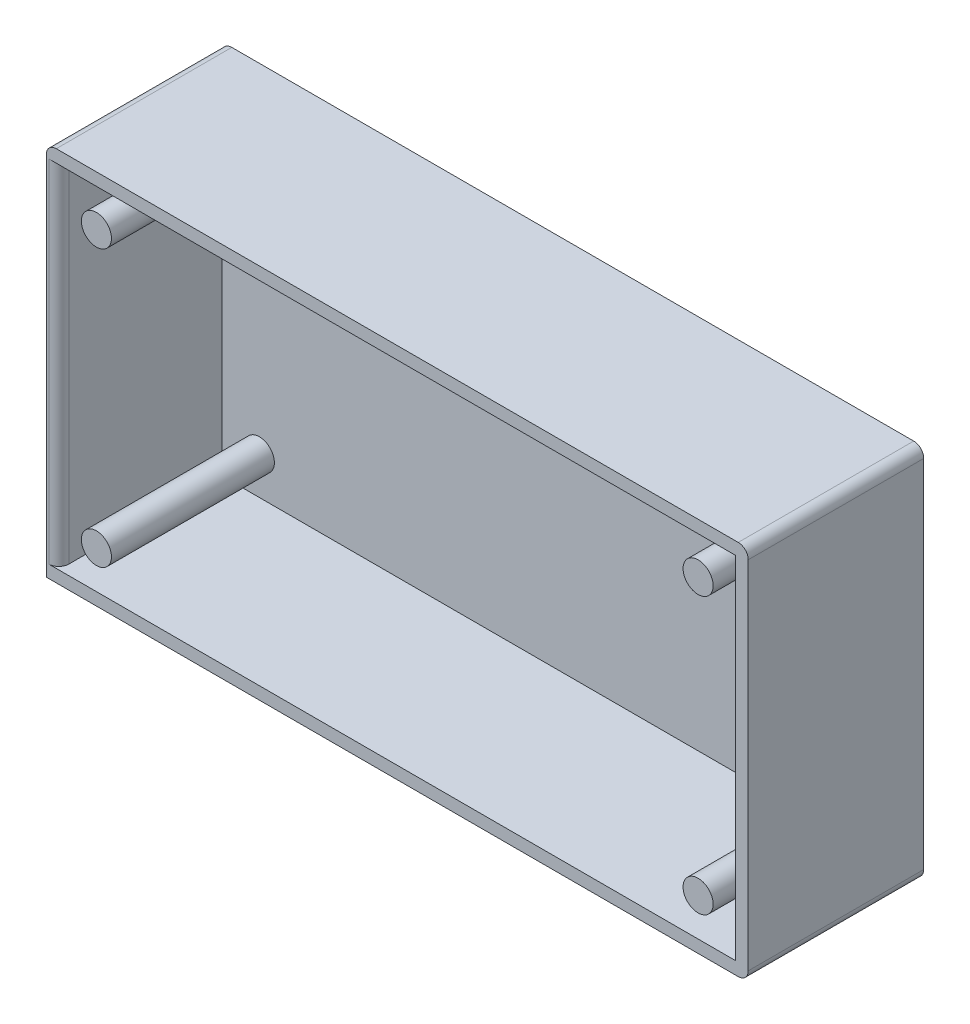
ISO-10303-21;
HEADER;
FILE_DESCRIPTION(('STEP AP214'),'2;1');
FILE_NAME('part.step','',(''),(''),'','','');
FILE_SCHEMA(('AUTOMOTIVE_DESIGN { 1 0 10303 214 1 1 1 1 }'));
ENDSEC;
DATA;
#1=APPLICATION_CONTEXT('core data for automotive mechanical design processes');
#2=APPLICATION_PROTOCOL_DEFINITION('international standard','automotive_design',2000,#1);
#3=PRODUCT_CONTEXT('',#1,'mechanical');
#4=PRODUCT('Part','Part','',(#3));
#5=PRODUCT_RELATED_PRODUCT_CATEGORY('part','',(#4));
#6=PRODUCT_DEFINITION_FORMATION('','',#4);
#7=PRODUCT_DEFINITION_CONTEXT('part definition',#1,'design');
#8=PRODUCT_DEFINITION('design','',#6,#7);
#9=PRODUCT_DEFINITION_SHAPE('','',#8);
#10=(LENGTH_UNIT() NAMED_UNIT(*) SI_UNIT(.MILLI.,.METRE.));
#11=(NAMED_UNIT(*) PLANE_ANGLE_UNIT() SI_UNIT($,.RADIAN.));
#12=(NAMED_UNIT(*) SI_UNIT($,.STERADIAN.) SOLID_ANGLE_UNIT());
#13=UNCERTAINTY_MEASURE_WITH_UNIT(LENGTH_MEASURE(1.E-05),#10,'distance_accuracy_value','');
#14=(GEOMETRIC_REPRESENTATION_CONTEXT(3) GLOBAL_UNCERTAINTY_ASSIGNED_CONTEXT((#13)) GLOBAL_UNIT_ASSIGNED_CONTEXT((#10,
#11,#12)) REPRESENTATION_CONTEXT('',''));
#15=CARTESIAN_POINT('',(0.,0.,0.));
#16=DIRECTION('',(0.,0.,1.));
#17=DIRECTION('',(1.,0.,0.));
#18=AXIS2_PLACEMENT_3D('',#15,#16,#17);
#19=CARTESIAN_POINT('',(0.,0.,2.5));
#20=DIRECTION('',(0.,0.,-1.));
#21=DIRECTION('',(-1.,0.,0.));
#22=AXIS2_PLACEMENT_3D('',#19,#20,#21);
#23=PLANE('',#22);
#24=CARTESIAN_POINT('',(65.,-32.5,2.5));
#25=DIRECTION('',(0.,0.,-1.));
#26=DIRECTION('',(-1.,0.,0.));
#27=AXIS2_PLACEMENT_3D('',#24,#25,#26);
#28=CIRCLE('',#27,2.5);
#29=CARTESIAN_POINT('',(65.,-35.,2.5));
#30=VERTEX_POINT('',#29);
#31=CARTESIAN_POINT('',(67.5,-32.5,2.5));
#32=VERTEX_POINT('',#31);
#33=EDGE_CURVE('E242',#30,#32,#28,.F.);
#34=ORIENTED_EDGE('',*,*,#33,.F.);
#35=DIRECTION('',(1.,0.,0.));
#36=VECTOR('',#35,1.);
#37=CARTESIAN_POINT('',(0.,-35.,2.5));
#38=LINE('',#37,#36);
#39=CARTESIAN_POINT('',(67.5,-35.,2.5));
#40=VERTEX_POINT('',#39);
#41=EDGE_CURVE('E188',#30,#40,#38,.T.);
#42=ORIENTED_EDGE('',*,*,#41,.T.);
#43=DIRECTION('',(0.,1.,0.));
#44=VECTOR('',#43,1.);
#45=CARTESIAN_POINT('',(67.5,0.,2.5));
#46=LINE('',#45,#44);
#47=EDGE_CURVE('E170',#40,#32,#46,.T.);
#48=ORIENTED_EDGE('',*,*,#47,.T.);
#49=EDGE_LOOP('',(#34,#42,#48));
#50=FACE_BOUND('',#49,.T.);
#51=ADVANCED_FACE('F39',(#50),#23,.F.);
#52=CARTESIAN_POINT('',(65.,32.5,2.5));
#53=DIRECTION('',(0.,0.,-1.));
#54=DIRECTION('',(-1.,0.,0.));
#55=AXIS2_PLACEMENT_3D('',#52,#53,#54);
#56=CIRCLE('',#55,2.5);
#57=CARTESIAN_POINT('',(67.5,32.5,2.5));
#58=VERTEX_POINT('',#57);
#59=CARTESIAN_POINT('',(65.,35.,2.5));
#60=VERTEX_POINT('',#59);
#61=EDGE_CURVE('E143',#58,#60,#56,.F.);
#62=ORIENTED_EDGE('',*,*,#61,.F.);
#63=CARTESIAN_POINT('',(67.5,35.,2.5));
#64=VERTEX_POINT('',#63);
#65=EDGE_CURVE('E155',#58,#64,#46,.T.);
#66=ORIENTED_EDGE('',*,*,#65,.T.);
#67=DIRECTION('',(-1.,0.,0.));
#68=VECTOR('',#67,1.);
#69=CARTESIAN_POINT('',(0.,35.,2.5));
#70=LINE('',#69,#68);
#71=EDGE_CURVE('E152',#64,#60,#70,.T.);
#72=ORIENTED_EDGE('',*,*,#71,.T.);
#73=EDGE_LOOP('',(#62,#66,#72));
#74=FACE_BOUND('',#73,.T.);
#75=ADVANCED_FACE('F151',(#74),#23,.F.);
#76=CARTESIAN_POINT('',(0.,0.,35.));
#77=DIRECTION('',(0.,0.,-1.));
#78=DIRECTION('',(-1.,0.,0.));
#79=AXIS2_PLACEMENT_3D('',#76,#77,#78);
#80=PLANE('',#79);
#81=DIRECTION('',(0.,1.,0.));
#82=VECTOR('',#81,1.);
#83=CARTESIAN_POINT('',(70.,-37.5,35.));
#84=LINE('',#83,#82);
#85=CARTESIAN_POINT('',(70.,-35.5,35.));
#86=VERTEX_POINT('',#85);
#87=CARTESIAN_POINT('',(70.,35.5,35.));
#88=VERTEX_POINT('',#87);
#89=EDGE_CURVE('E196',#86,#88,#84,.T.);
#90=ORIENTED_EDGE('',*,*,#89,.T.);
#91=CARTESIAN_POINT('',(68.,35.5,35.));
#92=DIRECTION('',(0.,0.,-1.));
#93=DIRECTION('',(-1.,0.,0.));
#94=AXIS2_PLACEMENT_3D('',#91,#92,#93);
#95=CIRCLE('',#94,2.);
#96=CARTESIAN_POINT('',(68.,37.5,35.));
#97=VERTEX_POINT('',#96);
#98=EDGE_CURVE('E266',#88,#97,#95,.F.);
#99=ORIENTED_EDGE('',*,*,#98,.T.);
#100=DIRECTION('',(-1.,0.,0.));
#101=VECTOR('',#100,1.);
#102=CARTESIAN_POINT('',(-70.,37.5,35.));
#103=LINE('',#102,#101);
#104=CARTESIAN_POINT('',(-68.,37.5,35.));
#105=VERTEX_POINT('',#104);
#106=EDGE_CURVE('E203',#97,#105,#103,.T.);
#107=ORIENTED_EDGE('',*,*,#106,.T.);
#108=CARTESIAN_POINT('',(-68.,35.5,35.));
#109=DIRECTION('',(0.,0.,-1.));
#110=DIRECTION('',(-1.,0.,0.));
#111=AXIS2_PLACEMENT_3D('',#108,#109,#110);
#112=CIRCLE('',#111,2.);
#113=CARTESIAN_POINT('',(-70.,35.5,35.));
#114=VERTEX_POINT('',#113);
#115=EDGE_CURVE('E262',#105,#114,#112,.F.);
#116=ORIENTED_EDGE('',*,*,#115,.T.);
#117=DIRECTION('',(0.,-1.,0.));
#118=VECTOR('',#117,1.);
#119=CARTESIAN_POINT('',(-70.,-37.5,35.));
#120=LINE('',#119,#118);
#121=CARTESIAN_POINT('',(-70.,-37.5,35.));
#122=VERTEX_POINT('',#121);
#123=EDGE_CURVE('E202',#114,#122,#120,.T.);
#124=ORIENTED_EDGE('',*,*,#123,.T.);
#125=DIRECTION('',(1.,0.,0.));
#126=VECTOR('',#125,1.);
#127=CARTESIAN_POINT('',(-70.,-37.5,35.));
#128=LINE('',#127,#126);
#129=CARTESIAN_POINT('',(68.,-37.5,35.));
#130=VERTEX_POINT('',#129);
#131=EDGE_CURVE('E210',#122,#130,#128,.T.);
#132=ORIENTED_EDGE('',*,*,#131,.T.);
#133=CARTESIAN_POINT('',(68.,-35.5,35.));
#134=DIRECTION('',(0.,0.,-1.));
#135=DIRECTION('',(-1.,0.,0.));
#136=AXIS2_PLACEMENT_3D('',#133,#134,#135);
#137=CIRCLE('',#136,2.);
#138=EDGE_CURVE('E265',#130,#86,#137,.F.);
#139=ORIENTED_EDGE('',*,*,#138,.T.);
#140=EDGE_LOOP('',(#90,#99,#107,#116,#124,#132,#139));
#141=FACE_BOUND('',#140,.T.);
#142=DIRECTION('',(1.,0.,0.));
#143=VECTOR('',#142,1.);
#144=CARTESIAN_POINT('',(0.,-35.,35.));
#145=LINE('',#144,#143);
#146=CARTESIAN_POINT('',(-69.5,-35.,35.));
#147=VERTEX_POINT('',#146);
#148=CARTESIAN_POINT('',(67.5,-35.,35.));
#149=VERTEX_POINT('',#148);
#150=EDGE_CURVE('E181',#147,#149,#145,.T.);
#151=ORIENTED_EDGE('',*,*,#150,.F.);
#152=DIRECTION('',(0.,-1.,0.));
#153=VECTOR('',#152,1.);
#154=CARTESIAN_POINT('',(-69.5,35.,35.));
#155=LINE('',#154,#153);
#156=CARTESIAN_POINT('',(-69.5,35.,35.));
#157=VERTEX_POINT('',#156);
#158=EDGE_CURVE('E259',#147,#157,#155,.F.);
#159=ORIENTED_EDGE('',*,*,#158,.T.);
#160=DIRECTION('',(-1.,0.,0.));
#161=VECTOR('',#160,1.);
#162=CARTESIAN_POINT('',(0.,35.,35.));
#163=LINE('',#162,#161);
#164=CARTESIAN_POINT('',(67.5,35.,35.));
#165=VERTEX_POINT('',#164);
#166=EDGE_CURVE('E191',#165,#157,#163,.T.);
#167=ORIENTED_EDGE('',*,*,#166,.F.);
#168=DIRECTION('',(0.,1.,0.));
#169=VECTOR('',#168,1.);
#170=CARTESIAN_POINT('',(67.5,0.,35.));
#171=LINE('',#170,#169);
#172=EDGE_CURVE('E192',#149,#165,#171,.T.);
#173=ORIENTED_EDGE('',*,*,#172,.F.);
#174=EDGE_LOOP('',(#151,#159,#167,#173));
#175=FACE_BOUND('',#174,.T.);
#176=ADVANCED_FACE('F281',(#141,#175),#80,.F.);
#177=CARTESIAN_POINT('',(70.,-37.5,35.));
#178=DIRECTION('',(-1.,0.,0.));
#179=DIRECTION('',(0.,0.,1.));
#180=AXIS2_PLACEMENT_3D('',#177,#178,#179);
#181=PLANE('',#180);
#182=DIRECTION('',(0.,1.,0.));
#183=VECTOR('',#182,1.);
#184=CARTESIAN_POINT('',(70.,-37.5,0.));
#185=LINE('',#184,#183);
#186=CARTESIAN_POINT('',(70.,-35.5,0.));
#187=VERTEX_POINT('',#186);
#188=CARTESIAN_POINT('',(70.,35.5,0.));
#189=VERTEX_POINT('',#188);
#190=EDGE_CURVE('E179',#187,#189,#185,.T.);
#191=ORIENTED_EDGE('',*,*,#190,.T.);
#192=DIRECTION('',(0.,0.,-1.));
#193=VECTOR('',#192,1.);
#194=CARTESIAN_POINT('',(70.,35.5,35.));
#195=LINE('',#194,#193);
#196=EDGE_CURVE('E260',#189,#88,#195,.F.);
#197=ORIENTED_EDGE('',*,*,#196,.T.);
#198=ORIENTED_EDGE('',*,*,#89,.F.);
#199=DIRECTION('',(0.,0.,-1.));
#200=VECTOR('',#199,1.);
#201=CARTESIAN_POINT('',(70.,-35.5,35.));
#202=LINE('',#201,#200);
#203=EDGE_CURVE('E255',#86,#187,#202,.T.);
#204=ORIENTED_EDGE('',*,*,#203,.T.);
#205=EDGE_LOOP('',(#191,#197,#198,#204));
#206=FACE_BOUND('',#205,.T.);
#207=ADVANCED_FACE('F347',(#206),#181,.F.);
#208=CARTESIAN_POINT('',(-70.,37.5,35.));
#209=DIRECTION('',(0.,-1.,0.));
#210=DIRECTION('',(0.,0.,-1.));
#211=AXIS2_PLACEMENT_3D('',#208,#209,#210);
#212=PLANE('',#211);
#213=ORIENTED_EDGE('',*,*,#106,.F.);
#214=DIRECTION('',(0.,0.,-1.));
#215=VECTOR('',#214,1.);
#216=CARTESIAN_POINT('',(68.,37.5,35.));
#217=LINE('',#216,#215);
#218=CARTESIAN_POINT('',(68.,37.5,0.));
#219=VERTEX_POINT('',#218);
#220=EDGE_CURVE('E245',#97,#219,#217,.T.);
#221=ORIENTED_EDGE('',*,*,#220,.T.);
#222=DIRECTION('',(-1.,0.,0.));
#223=VECTOR('',#222,1.);
#224=CARTESIAN_POINT('',(-70.,37.5,0.));
#225=LINE('',#224,#223);
#226=CARTESIAN_POINT('',(-68.,37.5,0.));
#227=VERTEX_POINT('',#226);
#228=EDGE_CURVE('E213',#219,#227,#225,.T.);
#229=ORIENTED_EDGE('',*,*,#228,.T.);
#230=DIRECTION('',(0.,0.,-1.));
#231=VECTOR('',#230,1.);
#232=CARTESIAN_POINT('',(-68.,37.5,35.));
#233=LINE('',#232,#231);
#234=EDGE_CURVE('E244',#227,#105,#233,.F.);
#235=ORIENTED_EDGE('',*,*,#234,.T.);
#236=EDGE_LOOP('',(#213,#221,#229,#235));
#237=FACE_BOUND('',#236,.T.);
#238=ADVANCED_FACE('F344',(#237),#212,.F.);
#239=CARTESIAN_POINT('',(-70.,-37.5,35.));
#240=DIRECTION('',(1.,0.,0.));
#241=DIRECTION('',(0.,0.,-1.));
#242=AXIS2_PLACEMENT_3D('',#239,#240,#241);
#243=PLANE('',#242);
#244=ORIENTED_EDGE('',*,*,#123,.F.);
#245=DIRECTION('',(0.,0.,-1.));
#246=VECTOR('',#245,1.);
#247=CARTESIAN_POINT('',(-70.,35.5,35.));
#248=LINE('',#247,#246);
#249=CARTESIAN_POINT('',(-70.,35.5,0.));
#250=VERTEX_POINT('',#249);
#251=EDGE_CURVE('E268',#114,#250,#248,.T.);
#252=ORIENTED_EDGE('',*,*,#251,.T.);
#253=DIRECTION('',(0.,-1.,0.));
#254=VECTOR('',#253,1.);
#255=CARTESIAN_POINT('',(-70.,-37.5,0.));
#256=LINE('',#255,#254);
#257=CARTESIAN_POINT('',(-70.,-37.5,0.));
#258=VERTEX_POINT('',#257);
#259=EDGE_CURVE('E216',#250,#258,#256,.T.);
#260=ORIENTED_EDGE('',*,*,#259,.T.);
#261=DIRECTION('',(0.,0.,-1.));
#262=VECTOR('',#261,1.);
#263=CARTESIAN_POINT('',(-70.,-37.5,35.));
#264=LINE('',#263,#262);
#265=EDGE_CURVE('E209',#122,#258,#264,.T.);
#266=ORIENTED_EDGE('',*,*,#265,.F.);
#267=EDGE_LOOP('',(#244,#252,#260,#266));
#268=FACE_BOUND('',#267,.T.);
#269=ADVANCED_FACE('F331',(#268),#243,.F.);
#270=CARTESIAN_POINT('',(-70.,-37.5,35.));
#271=DIRECTION('',(0.,1.,0.));
#272=DIRECTION('',(0.,0.,1.));
#273=AXIS2_PLACEMENT_3D('',#270,#271,#272);
#274=PLANE('',#273);
#275=DIRECTION('',(1.,0.,0.));
#276=VECTOR('',#275,1.);
#277=CARTESIAN_POINT('',(-70.,-37.5,0.));
#278=LINE('',#277,#276);
#279=CARTESIAN_POINT('',(68.,-37.5,0.));
#280=VERTEX_POINT('',#279);
#281=EDGE_CURVE('E205',#258,#280,#278,.T.);
#282=ORIENTED_EDGE('',*,*,#281,.T.);
#283=DIRECTION('',(0.,0.,-1.));
#284=VECTOR('',#283,1.);
#285=CARTESIAN_POINT('',(68.,-37.5,35.));
#286=LINE('',#285,#284);
#287=EDGE_CURVE('E271',#280,#130,#286,.F.);
#288=ORIENTED_EDGE('',*,*,#287,.T.);
#289=ORIENTED_EDGE('',*,*,#131,.F.);
#290=ORIENTED_EDGE('',*,*,#265,.T.);
#291=EDGE_LOOP('',(#282,#288,#289,#290));
#292=FACE_BOUND('',#291,.T.);
#293=ADVANCED_FACE('F327',(#292),#274,.F.);
#294=CARTESIAN_POINT('',(0.,0.,0.));
#295=DIRECTION('',(0.,0.,-1.));
#296=DIRECTION('',(-1.,0.,0.));
#297=AXIS2_PLACEMENT_3D('',#294,#295,#296);
#298=PLANE('',#297);
#299=CARTESIAN_POINT('',(65.,-32.5,0.));
#300=DIRECTION('',(0.,0.,1.));
#301=DIRECTION('',(1.,0.,0.));
#302=AXIS2_PLACEMENT_3D('',#299,#300,#301);
#303=CIRCLE('',#302,2.5);
#304=CARTESIAN_POINT('',(67.5,-32.5,0.));
#305=VERTEX_POINT('',#304);
#306=EDGE_CURVE('E577',#305,#305,#303,.T.);
#307=ORIENTED_EDGE('',*,*,#306,.T.);
#308=EDGE_LOOP('',(#307));
#309=FACE_BOUND('',#308,.T.);
#310=CARTESIAN_POINT('',(-65.,32.5,0.));
#311=DIRECTION('',(0.,0.,1.));
#312=DIRECTION('',(1.,0.,0.));
#313=AXIS2_PLACEMENT_3D('',#310,#311,#312);
#314=CIRCLE('',#313,2.25);
#315=CARTESIAN_POINT('',(-62.75,32.5,0.));
#316=VERTEX_POINT('',#315);
#317=EDGE_CURVE('E576',#316,#316,#314,.T.);
#318=ORIENTED_EDGE('',*,*,#317,.T.);
#319=EDGE_LOOP('',(#318));
#320=FACE_BOUND('',#319,.T.);
#321=CARTESIAN_POINT('',(65.,32.5,0.));
#322=DIRECTION('',(0.,0.,1.));
#323=DIRECTION('',(1.,0.,0.));
#324=AXIS2_PLACEMENT_3D('',#321,#322,#323);
#325=CIRCLE('',#324,2.5);
#326=CARTESIAN_POINT('',(67.5,32.5,0.));
#327=VERTEX_POINT('',#326);
#328=EDGE_CURVE('E584',#327,#327,#325,.T.);
#329=ORIENTED_EDGE('',*,*,#328,.T.);
#330=EDGE_LOOP('',(#329));
#331=FACE_BOUND('',#330,.T.);
#332=CARTESIAN_POINT('',(-65.,-32.5,0.));
#333=DIRECTION('',(0.,0.,1.));
#334=DIRECTION('',(1.,0.,0.));
#335=AXIS2_PLACEMENT_3D('',#332,#333,#334);
#336=CIRCLE('',#335,2.25);
#337=CARTESIAN_POINT('',(-62.75,-32.5,0.));
#338=VERTEX_POINT('',#337);
#339=EDGE_CURVE('E237',#338,#338,#336,.T.);
#340=ORIENTED_EDGE('',*,*,#339,.T.);
#341=EDGE_LOOP('',(#340));
#342=FACE_BOUND('',#341,.T.);
#343=ORIENTED_EDGE('',*,*,#228,.F.);
#344=CARTESIAN_POINT('',(68.,35.5,0.));
#345=DIRECTION('',(0.,0.,-1.));
#346=DIRECTION('',(-1.,0.,0.));
#347=AXIS2_PLACEMENT_3D('',#344,#345,#346);
#348=CIRCLE('',#347,2.);
#349=EDGE_CURVE('E252',#219,#189,#348,.T.);
#350=ORIENTED_EDGE('',*,*,#349,.T.);
#351=ORIENTED_EDGE('',*,*,#190,.F.);
#352=CARTESIAN_POINT('',(68.,-35.5,0.));
#353=DIRECTION('',(0.,0.,-1.));
#354=DIRECTION('',(-1.,0.,0.));
#355=AXIS2_PLACEMENT_3D('',#352,#353,#354);
#356=CIRCLE('',#355,2.);
#357=EDGE_CURVE('E247',#187,#280,#356,.T.);
#358=ORIENTED_EDGE('',*,*,#357,.T.);
#359=ORIENTED_EDGE('',*,*,#281,.F.);
#360=ORIENTED_EDGE('',*,*,#259,.F.);
#361=CARTESIAN_POINT('',(-68.,35.5,0.));
#362=DIRECTION('',(0.,0.,-1.));
#363=DIRECTION('',(-1.,0.,0.));
#364=AXIS2_PLACEMENT_3D('',#361,#362,#363);
#365=CIRCLE('',#364,2.);
#366=EDGE_CURVE('E246',#250,#227,#365,.T.);
#367=ORIENTED_EDGE('',*,*,#366,.T.);
#368=EDGE_LOOP('',(#343,#350,#351,#358,#359,#360,#367));
#369=FACE_BOUND('',#368,.T.);
#370=ADVANCED_FACE('F322',(#309,#320,#331,#342,#369),#298,.T.);
#371=CARTESIAN_POINT('',(67.5,-37.5,35.));
#372=DIRECTION('',(-1.,0.,0.));
#373=DIRECTION('',(0.,0.,1.));
#374=AXIS2_PLACEMENT_3D('',#371,#372,#373);
#375=PLANE('',#374);
#376=ORIENTED_EDGE('',*,*,#172,.T.);
#377=DIRECTION('',(0.,0.,-1.));
#378=VECTOR('',#377,1.);
#379=CARTESIAN_POINT('',(67.5,35.,35.));
#380=LINE('',#379,#378);
#381=EDGE_CURVE('E163',#165,#64,#380,.T.);
#382=ORIENTED_EDGE('',*,*,#381,.T.);
#383=ORIENTED_EDGE('',*,*,#65,.F.);
#384=EDGE_CURVE('E161',#32,#58,#46,.T.);
#385=ORIENTED_EDGE('',*,*,#384,.F.);
#386=ORIENTED_EDGE('',*,*,#47,.F.);
#387=DIRECTION('',(0.,0.,-1.));
#388=VECTOR('',#387,1.);
#389=CARTESIAN_POINT('',(67.5,-35.,35.));
#390=LINE('',#389,#388);
#391=EDGE_CURVE('E180',#149,#40,#390,.T.);
#392=ORIENTED_EDGE('',*,*,#391,.F.);
#393=EDGE_LOOP('',(#376,#382,#383,#385,#386,#392));
#394=FACE_BOUND('',#393,.T.);
#395=ADVANCED_FACE('F157',(#394),#375,.T.);
#396=CARTESIAN_POINT('',(-70.,35.,35.));
#397=DIRECTION('',(0.,-1.,0.));
#398=DIRECTION('',(0.,0.,-1.));
#399=AXIS2_PLACEMENT_3D('',#396,#397,#398);
#400=PLANE('',#399);
#401=ORIENTED_EDGE('',*,*,#166,.T.);
#402=CARTESIAN_POINT('',(-69.5,35.,33.));
#403=DIRECTION('',(0.,-1.,0.));
#404=DIRECTION('',(0.,0.,-1.));
#405=AXIS2_PLACEMENT_3D('',#402,#403,#404);
#406=CIRCLE('',#405,2.);
#407=CARTESIAN_POINT('',(-67.5,35.,33.));
#408=VERTEX_POINT('',#407);
#409=EDGE_CURVE('E11',#157,#408,#406,.F.);
#410=ORIENTED_EDGE('',*,*,#409,.T.);
#411=DIRECTION('',(0.,0.,-1.));
#412=VECTOR('',#411,1.);
#413=CARTESIAN_POINT('',(-67.5,35.,35.));
#414=LINE('',#413,#412);
#415=CARTESIAN_POINT('',(-67.5,35.,2.5));
#416=VERTEX_POINT('',#415);
#417=EDGE_CURVE('E177',#408,#416,#414,.T.);
#418=ORIENTED_EDGE('',*,*,#417,.T.);
#419=EDGE_CURVE('E172',#60,#416,#70,.T.);
#420=ORIENTED_EDGE('',*,*,#419,.F.);
#421=ORIENTED_EDGE('',*,*,#71,.F.);
#422=ORIENTED_EDGE('',*,*,#381,.F.);
#423=EDGE_LOOP('',(#401,#410,#418,#420,#421,#422));
#424=FACE_BOUND('',#423,.T.);
#425=ADVANCED_FACE('F284',(#424),#400,.T.);
#426=CARTESIAN_POINT('',(-67.5,-37.5,35.));
#427=DIRECTION('',(1.,0.,0.));
#428=DIRECTION('',(0.,0.,-1.));
#429=AXIS2_PLACEMENT_3D('',#426,#427,#428);
#430=PLANE('',#429);
#431=ORIENTED_EDGE('',*,*,#417,.F.);
#432=DIRECTION('',(0.,-1.,0.));
#433=VECTOR('',#432,1.);
#434=CARTESIAN_POINT('',(-67.5,-35.,33.));
#435=LINE('',#434,#433);
#436=CARTESIAN_POINT('',(-67.5,-35.,33.));
#437=VERTEX_POINT('',#436);
#438=EDGE_CURVE('E272',#408,#437,#435,.T.);
#439=ORIENTED_EDGE('',*,*,#438,.T.);
#440=DIRECTION('',(0.,0.,-1.));
#441=VECTOR('',#440,1.);
#442=CARTESIAN_POINT('',(-67.5,-35.,35.));
#443=LINE('',#442,#441);
#444=CARTESIAN_POINT('',(-67.5,-35.,2.5));
#445=VERTEX_POINT('',#444);
#446=EDGE_CURVE('E185',#437,#445,#443,.T.);
#447=ORIENTED_EDGE('',*,*,#446,.T.);
#448=DIRECTION('',(0.,-1.,0.));
#449=VECTOR('',#448,1.);
#450=CARTESIAN_POINT('',(-67.5,0.,2.5));
#451=LINE('',#450,#449);
#452=EDGE_CURVE('E183',#416,#445,#451,.T.);
#453=ORIENTED_EDGE('',*,*,#452,.F.);
#454=EDGE_LOOP('',(#431,#439,#447,#453));
#455=FACE_BOUND('',#454,.T.);
#456=ADVANCED_FACE('F288',(#455),#430,.T.);
#457=CARTESIAN_POINT('',(-70.,-35.,35.));
#458=DIRECTION('',(0.,1.,0.));
#459=DIRECTION('',(0.,0.,1.));
#460=AXIS2_PLACEMENT_3D('',#457,#458,#459);
#461=PLANE('',#460);
#462=ORIENTED_EDGE('',*,*,#150,.T.);
#463=ORIENTED_EDGE('',*,*,#391,.T.);
#464=ORIENTED_EDGE('',*,*,#41,.F.);
#465=EDGE_CURVE('E193',#445,#30,#38,.T.);
#466=ORIENTED_EDGE('',*,*,#465,.F.);
#467=ORIENTED_EDGE('',*,*,#446,.F.);
#468=CARTESIAN_POINT('',(-69.5,-35.,33.));
#469=DIRECTION('',(0.,1.,0.));
#470=DIRECTION('',(0.,0.,1.));
#471=AXIS2_PLACEMENT_3D('',#468,#469,#470);
#472=CIRCLE('',#471,2.);
#473=EDGE_CURVE('E50',#437,#147,#472,.F.);
#474=ORIENTED_EDGE('',*,*,#473,.T.);
#475=EDGE_LOOP('',(#462,#463,#464,#466,#467,#474));
#476=FACE_BOUND('',#475,.T.);
#477=ADVANCED_FACE('F277',(#476),#461,.T.);
#478=EDGE_CURVE('E154',#32,#30,#28,.F.);
#479=ORIENTED_EDGE('',*,*,#478,.F.);
#480=ORIENTED_EDGE('',*,*,#384,.T.);
#481=EDGE_CURVE('E137',#60,#58,#56,.F.);
#482=ORIENTED_EDGE('',*,*,#481,.F.);
#483=ORIENTED_EDGE('',*,*,#419,.T.);
#484=ORIENTED_EDGE('',*,*,#452,.T.);
#485=ORIENTED_EDGE('',*,*,#465,.T.);
#486=EDGE_LOOP('',(#479,#480,#482,#483,#484,#485));
#487=FACE_BOUND('',#486,.T.);
#488=CARTESIAN_POINT('',(-65.,32.5,2.5));
#489=DIRECTION('',(0.,0.,-1.));
#490=DIRECTION('',(-1.,0.,0.));
#491=AXIS2_PLACEMENT_3D('',#488,#489,#490);
#492=CIRCLE('',#491,2.25);
#493=CARTESIAN_POINT('',(-67.25,32.5,2.5));
#494=VERTEX_POINT('',#493);
#495=EDGE_CURVE('E231',#494,#494,#492,.F.);
#496=ORIENTED_EDGE('',*,*,#495,.F.);
#497=EDGE_LOOP('',(#496));
#498=FACE_BOUND('',#497,.T.);
#499=CARTESIAN_POINT('',(-65.,-32.5,2.5));
#500=DIRECTION('',(0.,0.,-1.));
#501=DIRECTION('',(-1.,0.,0.));
#502=AXIS2_PLACEMENT_3D('',#499,#500,#501);
#503=CIRCLE('',#502,2.25);
#504=CARTESIAN_POINT('',(-67.25,-32.5,2.5));
#505=VERTEX_POINT('',#504);
#506=EDGE_CURVE('E232',#505,#505,#503,.F.);
#507=ORIENTED_EDGE('',*,*,#506,.F.);
#508=EDGE_LOOP('',(#507));
#509=FACE_BOUND('',#508,.T.);
#510=CARTESIAN_POINT('',(60.,-27.5,2.5));
#511=DIRECTION('',(0.,0.,-1.));
#512=DIRECTION('',(-1.,0.,0.));
#513=AXIS2_PLACEMENT_3D('',#510,#511,#512);
#514=CIRCLE('',#513,3.);
#515=CARTESIAN_POINT('',(57.,-27.5,2.5));
#516=VERTEX_POINT('',#515);
#517=EDGE_CURVE('E148',#516,#516,#514,.F.);
#518=ORIENTED_EDGE('',*,*,#517,.F.);
#519=EDGE_LOOP('',(#518));
#520=FACE_BOUND('',#519,.T.);
#521=CARTESIAN_POINT('',(-60.,27.5,2.5));
#522=DIRECTION('',(0.,0.,-1.));
#523=DIRECTION('',(-1.,0.,0.));
#524=AXIS2_PLACEMENT_3D('',#521,#522,#523);
#525=CIRCLE('',#524,3.);
#526=CARTESIAN_POINT('',(-63.,27.5,2.5));
#527=VERTEX_POINT('',#526);
#528=EDGE_CURVE('E229',#527,#527,#525,.F.);
#529=ORIENTED_EDGE('',*,*,#528,.F.);
#530=EDGE_LOOP('',(#529));
#531=FACE_BOUND('',#530,.T.);
#532=CARTESIAN_POINT('',(60.,27.5,2.5));
#533=DIRECTION('',(0.,0.,-1.));
#534=DIRECTION('',(-1.,0.,0.));
#535=AXIS2_PLACEMENT_3D('',#532,#533,#534);
#536=CIRCLE('',#535,3.);
#537=CARTESIAN_POINT('',(57.,27.5,2.5));
#538=VERTEX_POINT('',#537);
#539=EDGE_CURVE('E223',#538,#538,#536,.F.);
#540=ORIENTED_EDGE('',*,*,#539,.F.);
#541=EDGE_LOOP('',(#540));
#542=FACE_BOUND('',#541,.T.);
#543=CARTESIAN_POINT('',(-60.,-27.5,2.5));
#544=DIRECTION('',(0.,0.,-1.));
#545=DIRECTION('',(-1.,0.,0.));
#546=AXIS2_PLACEMENT_3D('',#543,#544,#545);
#547=CIRCLE('',#546,3.);
#548=CARTESIAN_POINT('',(-63.,-27.5,2.5));
#549=VERTEX_POINT('',#548);
#550=EDGE_CURVE('E225',#549,#549,#547,.F.);
#551=ORIENTED_EDGE('',*,*,#550,.F.);
#552=EDGE_LOOP('',(#551));
#553=FACE_BOUND('',#552,.T.);
#554=ADVANCED_FACE('F166',(#487,#498,#509,#520,#531,#542,#553),#23,.F.);
#555=CARTESIAN_POINT('',(-60.,-27.5,35.));
#556=DIRECTION('',(0.,0.,-1.));
#557=DIRECTION('',(-1.,0.,0.));
#558=AXIS2_PLACEMENT_3D('',#555,#556,#557);
#559=CYLINDRICAL_SURFACE('',#558,3.);
#560=CARTESIAN_POINT('',(-60.,-27.5,35.));
#561=DIRECTION('',(0.,0.,1.));
#562=DIRECTION('',(1.,0.,0.));
#563=AXIS2_PLACEMENT_3D('',#560,#561,#562);
#564=CIRCLE('',#563,3.);
#565=CARTESIAN_POINT('',(-57.,-27.5,35.));
#566=VERTEX_POINT('',#565);
#567=EDGE_CURVE('E164',#566,#566,#564,.T.);
#568=ORIENTED_EDGE('',*,*,#567,.F.);
#569=EDGE_LOOP('',(#568));
#570=FACE_BOUND('',#569,.T.);
#571=ORIENTED_EDGE('',*,*,#550,.T.);
#572=EDGE_LOOP('',(#571));
#573=FACE_BOUND('',#572,.T.);
#574=ADVANCED_FACE('F301',(#570,#573),#559,.T.);
#575=CARTESIAN_POINT('',(-60.,-27.5,35.));
#576=DIRECTION('',(0.,0.,1.));
#577=DIRECTION('',(1.,0.,0.));
#578=AXIS2_PLACEMENT_3D('',#575,#576,#577);
#579=PLANE('',#578);
#580=ORIENTED_EDGE('',*,*,#567,.T.);
#581=EDGE_LOOP('',(#580));
#582=FACE_BOUND('',#581,.T.);
#583=ADVANCED_FACE('F313',(#582),#579,.T.);
#584=CARTESIAN_POINT('',(60.,27.5,35.));
#585=DIRECTION('',(0.,0.,-1.));
#586=DIRECTION('',(-1.,0.,0.));
#587=AXIS2_PLACEMENT_3D('',#584,#585,#586);
#588=CYLINDRICAL_SURFACE('',#587,3.);
#589=CARTESIAN_POINT('',(60.,27.5,35.));
#590=DIRECTION('',(0.,0.,1.));
#591=DIRECTION('',(1.,0.,0.));
#592=AXIS2_PLACEMENT_3D('',#589,#590,#591);
#593=CIRCLE('',#592,3.);
#594=CARTESIAN_POINT('',(63.,27.5,35.));
#595=VERTEX_POINT('',#594);
#596=EDGE_CURVE('E238',#595,#595,#593,.T.);
#597=ORIENTED_EDGE('',*,*,#596,.F.);
#598=EDGE_LOOP('',(#597));
#599=FACE_BOUND('',#598,.T.);
#600=ORIENTED_EDGE('',*,*,#539,.T.);
#601=EDGE_LOOP('',(#600));
#602=FACE_BOUND('',#601,.T.);
#603=ADVANCED_FACE('F320',(#599,#602),#588,.T.);
#604=CARTESIAN_POINT('',(60.,27.5,35.));
#605=DIRECTION('',(0.,0.,1.));
#606=DIRECTION('',(1.,0.,0.));
#607=AXIS2_PLACEMENT_3D('',#604,#605,#606);
#608=PLANE('',#607);
#609=ORIENTED_EDGE('',*,*,#596,.T.);
#610=EDGE_LOOP('',(#609));
#611=FACE_BOUND('',#610,.T.);
#612=ADVANCED_FACE('F461',(#611),#608,.T.);
#613=CARTESIAN_POINT('',(-60.,27.5,35.));
#614=DIRECTION('',(0.,0.,-1.));
#615=DIRECTION('',(-1.,0.,0.));
#616=AXIS2_PLACEMENT_3D('',#613,#614,#615);
#617=CYLINDRICAL_SURFACE('',#616,3.);
#618=CARTESIAN_POINT('',(-60.,27.5,35.));
#619=DIRECTION('',(0.,0.,1.));
#620=DIRECTION('',(1.,0.,0.));
#621=AXIS2_PLACEMENT_3D('',#618,#619,#620);
#622=CIRCLE('',#621,3.);
#623=CARTESIAN_POINT('',(-57.,27.5,35.));
#624=VERTEX_POINT('',#623);
#625=EDGE_CURVE('E591',#624,#624,#622,.T.);
#626=ORIENTED_EDGE('',*,*,#625,.F.);
#627=EDGE_LOOP('',(#626));
#628=FACE_BOUND('',#627,.T.);
#629=ORIENTED_EDGE('',*,*,#528,.T.);
#630=EDGE_LOOP('',(#629));
#631=FACE_BOUND('',#630,.T.);
#632=ADVANCED_FACE('F473',(#628,#631),#617,.T.);
#633=CARTESIAN_POINT('',(-60.,27.5,35.));
#634=DIRECTION('',(0.,0.,1.));
#635=DIRECTION('',(1.,0.,0.));
#636=AXIS2_PLACEMENT_3D('',#633,#634,#635);
#637=PLANE('',#636);
#638=ORIENTED_EDGE('',*,*,#625,.T.);
#639=EDGE_LOOP('',(#638));
#640=FACE_BOUND('',#639,.T.);
#641=ADVANCED_FACE('F481',(#640),#637,.T.);
#642=CARTESIAN_POINT('',(60.,-27.5,35.));
#643=DIRECTION('',(0.,0.,-1.));
#644=DIRECTION('',(-1.,0.,0.));
#645=AXIS2_PLACEMENT_3D('',#642,#643,#644);
#646=CYLINDRICAL_SURFACE('',#645,3.);
#647=CARTESIAN_POINT('',(60.,-27.5,35.));
#648=DIRECTION('',(0.,0.,1.));
#649=DIRECTION('',(1.,0.,0.));
#650=AXIS2_PLACEMENT_3D('',#647,#648,#649);
#651=CIRCLE('',#650,3.);
#652=CARTESIAN_POINT('',(63.,-27.5,35.));
#653=VERTEX_POINT('',#652);
#654=EDGE_CURVE('E595',#653,#653,#651,.T.);
#655=ORIENTED_EDGE('',*,*,#654,.F.);
#656=EDGE_LOOP('',(#655));
#657=FACE_BOUND('',#656,.T.);
#658=ORIENTED_EDGE('',*,*,#517,.T.);
#659=EDGE_LOOP('',(#658));
#660=FACE_BOUND('',#659,.T.);
#661=ADVANCED_FACE('F491',(#657,#660),#646,.T.);
#662=CARTESIAN_POINT('',(60.,-27.5,35.));
#663=DIRECTION('',(0.,0.,1.));
#664=DIRECTION('',(1.,0.,0.));
#665=AXIS2_PLACEMENT_3D('',#662,#663,#664);
#666=PLANE('',#665);
#667=ORIENTED_EDGE('',*,*,#654,.T.);
#668=EDGE_LOOP('',(#667));
#669=FACE_BOUND('',#668,.T.);
#670=ADVANCED_FACE('F498',(#669),#666,.T.);
#671=CARTESIAN_POINT('',(-65.,-32.5,35.));
#672=DIRECTION('',(0.,0.,-1.));
#673=DIRECTION('',(-1.,0.,0.));
#674=AXIS2_PLACEMENT_3D('',#671,#672,#673);
#675=CYLINDRICAL_SURFACE('',#674,2.25);
#676=ORIENTED_EDGE('',*,*,#339,.F.);
#677=EDGE_LOOP('',(#676));
#678=FACE_BOUND('',#677,.T.);
#679=ORIENTED_EDGE('',*,*,#506,.T.);
#680=EDGE_LOOP('',(#679));
#681=FACE_BOUND('',#680,.T.);
#682=ADVANCED_FACE('F510',(#678,#681),#675,.F.);
#683=CARTESIAN_POINT('',(65.,32.5,35.));
#684=DIRECTION('',(0.,0.,-1.));
#685=DIRECTION('',(-1.,0.,0.));
#686=AXIS2_PLACEMENT_3D('',#683,#684,#685);
#687=CYLINDRICAL_SURFACE('',#686,2.5);
#688=ORIENTED_EDGE('',*,*,#328,.F.);
#689=EDGE_LOOP('',(#688));
#690=FACE_BOUND('',#689,.T.);
#691=ORIENTED_EDGE('',*,*,#61,.T.);
#692=ORIENTED_EDGE('',*,*,#481,.T.);
#693=EDGE_LOOP('',(#691,#692));
#694=FACE_BOUND('',#693,.T.);
#695=ADVANCED_FACE('F136',(#690,#694),#687,.F.);
#696=CARTESIAN_POINT('',(-65.,32.5,35.));
#697=DIRECTION('',(0.,0.,-1.));
#698=DIRECTION('',(-1.,0.,0.));
#699=AXIS2_PLACEMENT_3D('',#696,#697,#698);
#700=CYLINDRICAL_SURFACE('',#699,2.25);
#701=ORIENTED_EDGE('',*,*,#317,.F.);
#702=EDGE_LOOP('',(#701));
#703=FACE_BOUND('',#702,.T.);
#704=ORIENTED_EDGE('',*,*,#495,.T.);
#705=EDGE_LOOP('',(#704));
#706=FACE_BOUND('',#705,.T.);
#707=ADVANCED_FACE('F536',(#703,#706),#700,.F.);
#708=CARTESIAN_POINT('',(65.,-32.5,35.));
#709=DIRECTION('',(0.,0.,-1.));
#710=DIRECTION('',(-1.,0.,0.));
#711=AXIS2_PLACEMENT_3D('',#708,#709,#710);
#712=CYLINDRICAL_SURFACE('',#711,2.5);
#713=ORIENTED_EDGE('',*,*,#306,.F.);
#714=EDGE_LOOP('',(#713));
#715=FACE_BOUND('',#714,.T.);
#716=ORIENTED_EDGE('',*,*,#33,.T.);
#717=ORIENTED_EDGE('',*,*,#478,.T.);
#718=EDGE_LOOP('',(#716,#717));
#719=FACE_BOUND('',#718,.T.);
#720=ADVANCED_FACE('F355',(#715,#719),#712,.F.);
#721=CARTESIAN_POINT('',(68.,35.5,35.));
#722=DIRECTION('',(0.,0.,-1.));
#723=DIRECTION('',(-1.,0.,0.));
#724=AXIS2_PLACEMENT_3D('',#721,#722,#723);
#725=CYLINDRICAL_SURFACE('',#724,2.);
#726=ORIENTED_EDGE('',*,*,#98,.F.);
#727=ORIENTED_EDGE('',*,*,#196,.F.);
#728=ORIENTED_EDGE('',*,*,#349,.F.);
#729=ORIENTED_EDGE('',*,*,#220,.F.);
#730=EDGE_LOOP('',(#726,#727,#728,#729));
#731=FACE_BOUND('',#730,.T.);
#732=ADVANCED_FACE('F351',(#731),#725,.T.);
#733=CARTESIAN_POINT('',(-68.,35.5,35.));
#734=DIRECTION('',(0.,0.,-1.));
#735=DIRECTION('',(-1.,0.,0.));
#736=AXIS2_PLACEMENT_3D('',#733,#734,#735);
#737=CYLINDRICAL_SURFACE('',#736,2.);
#738=ORIENTED_EDGE('',*,*,#115,.F.);
#739=ORIENTED_EDGE('',*,*,#234,.F.);
#740=ORIENTED_EDGE('',*,*,#366,.F.);
#741=ORIENTED_EDGE('',*,*,#251,.F.);
#742=EDGE_LOOP('',(#738,#739,#740,#741));
#743=FACE_BOUND('',#742,.T.);
#744=ADVANCED_FACE('F353',(#743),#737,.T.);
#745=CARTESIAN_POINT('',(68.,-35.5,35.));
#746=DIRECTION('',(0.,0.,-1.));
#747=DIRECTION('',(-1.,0.,0.));
#748=AXIS2_PLACEMENT_3D('',#745,#746,#747);
#749=CYLINDRICAL_SURFACE('',#748,2.);
#750=ORIENTED_EDGE('',*,*,#138,.F.);
#751=ORIENTED_EDGE('',*,*,#287,.F.);
#752=ORIENTED_EDGE('',*,*,#357,.F.);
#753=ORIENTED_EDGE('',*,*,#203,.F.);
#754=EDGE_LOOP('',(#750,#751,#752,#753));
#755=FACE_BOUND('',#754,.T.);
#756=ADVANCED_FACE('F357',(#755),#749,.T.);
#757=CARTESIAN_POINT('',(-69.5,-37.5,33.));
#758=DIRECTION('',(0.,1.,0.));
#759=DIRECTION('',(0.,0.,1.));
#760=AXIS2_PLACEMENT_3D('',#757,#758,#759);
#761=CYLINDRICAL_SURFACE('',#760,2.);
#762=ORIENTED_EDGE('',*,*,#409,.F.);
#763=ORIENTED_EDGE('',*,*,#158,.F.);
#764=ORIENTED_EDGE('',*,*,#473,.F.);
#765=ORIENTED_EDGE('',*,*,#438,.F.);
#766=EDGE_LOOP('',(#762,#763,#764,#765));
#767=FACE_BOUND('',#766,.T.);
#768=ADVANCED_FACE('F41',(#767),#761,.T.);
#769=CLOSED_SHELL('',(#51,#75,#176,#207,#238,#269,#293,#370,#395,#425,#456,#477,#554,#574,#583,
#603,#612,#632,#641,#661,#670,#682,#695,#707,#720,#732,#744,#756,#768));
#770=MANIFOLD_SOLID_BREP('B2',#769);
#771=ADVANCED_BREP_SHAPE_REPRESENTATION('',(#18,#770),#14);
#772=SHAPE_DEFINITION_REPRESENTATION(#9,#771);
ENDSEC;
END-ISO-10303-21;
